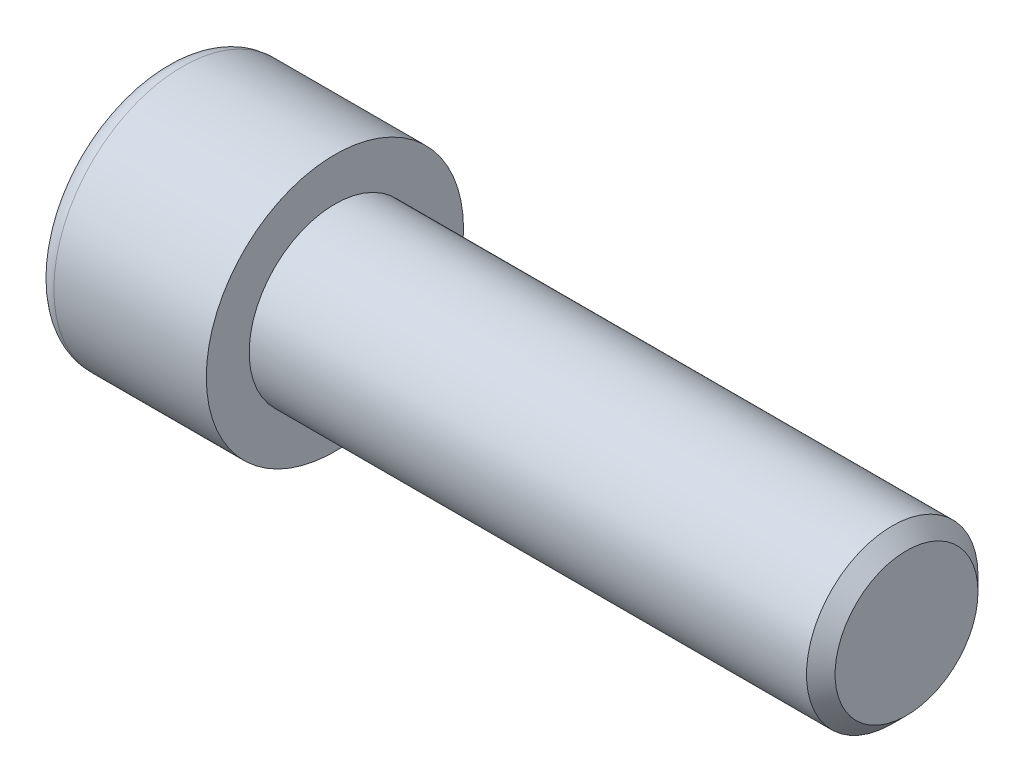
ISO-10303-21;
HEADER;
FILE_DESCRIPTION(('STEP AP214'),'2;1');
FILE_NAME('part.step','',(''),(''),'','','');
FILE_SCHEMA(('AUTOMOTIVE_DESIGN { 1 0 10303 214 1 1 1 1 }'));
ENDSEC;
DATA;
#1=APPLICATION_CONTEXT('core data for automotive mechanical design processes');
#2=APPLICATION_PROTOCOL_DEFINITION('international standard','automotive_design',2000,#1);
#3=PRODUCT_CONTEXT('',#1,'mechanical');
#4=PRODUCT('Part','Part','',(#3));
#5=PRODUCT_RELATED_PRODUCT_CATEGORY('part','',(#4));
#6=PRODUCT_DEFINITION_FORMATION('','',#4);
#7=PRODUCT_DEFINITION_CONTEXT('part definition',#1,'design');
#8=PRODUCT_DEFINITION('design','',#6,#7);
#9=PRODUCT_DEFINITION_SHAPE('','',#8);
#10=(LENGTH_UNIT() NAMED_UNIT(*) SI_UNIT(.MILLI.,.METRE.));
#11=(NAMED_UNIT(*) PLANE_ANGLE_UNIT() SI_UNIT($,.RADIAN.));
#12=(NAMED_UNIT(*) SI_UNIT($,.STERADIAN.) SOLID_ANGLE_UNIT());
#13=UNCERTAINTY_MEASURE_WITH_UNIT(LENGTH_MEASURE(1.E-05),#10,'distance_accuracy_value','');
#14=(GEOMETRIC_REPRESENTATION_CONTEXT(3) GLOBAL_UNCERTAINTY_ASSIGNED_CONTEXT((#13)) GLOBAL_UNIT_ASSIGNED_CONTEXT((#10,
#11,#12)) REPRESENTATION_CONTEXT('',''));
#15=CARTESIAN_POINT('',(0.,0.,0.));
#16=DIRECTION('',(0.,0.,1.));
#17=DIRECTION('',(1.,0.,0.));
#18=AXIS2_PLACEMENT_3D('',#15,#16,#17);
#19=CARTESIAN_POINT('',(20.,0.,0.));
#20=DIRECTION('',(-1.,0.,0.));
#21=DIRECTION('',(0.,0.,1.));
#22=AXIS2_PLACEMENT_3D('',#19,#20,#21);
#23=PLANE('',#22);
#24=CARTESIAN_POINT('',(20.,0.,0.));
#25=DIRECTION('',(-1.,0.,0.));
#26=DIRECTION('',(0.,0.,1.));
#27=AXIS2_PLACEMENT_3D('',#24,#25,#26);
#28=CIRCLE('',#27,13.5);
#29=CARTESIAN_POINT('',(20.,0.,13.5));
#30=VERTEX_POINT('',#29);
#31=CARTESIAN_POINT('',(20.,11.6913429510899,6.75));
#32=VERTEX_POINT('',#31);
#33=EDGE_CURVE('E139',#30,#32,#28,.T.);
#34=ORIENTED_EDGE('',*,*,#33,.F.);
#35=DIRECTION('',(0.,1.,0.));
#36=VECTOR('',#35,1.);
#37=CARTESIAN_POINT('',(20.,-7.79422863405995,13.5));
#38=LINE('',#37,#36);
#39=CARTESIAN_POINT('',(20.,7.79422863405995,13.5));
#40=VERTEX_POINT('',#39);
#41=EDGE_CURVE('E174',#30,#40,#38,.T.);
#42=ORIENTED_EDGE('',*,*,#41,.T.);
#43=DIRECTION('',(0.,0.5,-0.866025403784439));
#44=VECTOR('',#43,1.);
#45=CARTESIAN_POINT('',(20.,7.79422863405995,13.5));
#46=LINE('',#45,#44);
#47=EDGE_CURVE('E149',#40,#32,#46,.T.);
#48=ORIENTED_EDGE('',*,*,#47,.T.);
#49=EDGE_LOOP('',(#34,#42,#48));
#50=FACE_BOUND('',#49,.T.);
#51=ADVANCED_FACE('F53',(#50),#23,.T.);
#52=CARTESIAN_POINT('',(20.,11.6913429510899,-6.75));
#53=VERTEX_POINT('',#52);
#54=EDGE_CURVE('E145',#32,#53,#28,.T.);
#55=ORIENTED_EDGE('',*,*,#54,.F.);
#56=CARTESIAN_POINT('',(20.,15.5884572681199,0.));
#57=VERTEX_POINT('',#56);
#58=EDGE_CURVE('E154',#32,#57,#46,.T.);
#59=ORIENTED_EDGE('',*,*,#58,.T.);
#60=DIRECTION('',(0.,-0.5,-0.866025403784439));
#61=VECTOR('',#60,1.);
#62=CARTESIAN_POINT('',(20.,15.5884572681199,0.));
#63=LINE('',#62,#61);
#64=EDGE_CURVE('E155',#57,#53,#63,.T.);
#65=ORIENTED_EDGE('',*,*,#64,.T.);
#66=EDGE_LOOP('',(#55,#59,#65));
#67=FACE_BOUND('',#66,.T.);
#68=ADVANCED_FACE('F248',(#67),#23,.T.);
#69=CARTESIAN_POINT('',(20.,0.,-13.5));
#70=VERTEX_POINT('',#69);
#71=EDGE_CURVE('E321',#53,#70,#28,.T.);
#72=ORIENTED_EDGE('',*,*,#71,.F.);
#73=CARTESIAN_POINT('',(20.,7.79422863405995,-13.5));
#74=VERTEX_POINT('',#73);
#75=EDGE_CURVE('E153',#53,#74,#63,.T.);
#76=ORIENTED_EDGE('',*,*,#75,.T.);
#77=DIRECTION('',(0.,-1.,0.));
#78=VECTOR('',#77,1.);
#79=CARTESIAN_POINT('',(20.,7.79422863405995,-13.5));
#80=LINE('',#79,#78);
#81=EDGE_CURVE('E160',#74,#70,#80,.T.);
#82=ORIENTED_EDGE('',*,*,#81,.T.);
#83=EDGE_LOOP('',(#72,#76,#82));
#84=FACE_BOUND('',#83,.T.);
#85=ADVANCED_FACE('F255',(#84),#23,.T.);
#86=CARTESIAN_POINT('',(20.,-11.6913429510899,-6.75));
#87=VERTEX_POINT('',#86);
#88=EDGE_CURVE('E286',#70,#87,#28,.T.);
#89=ORIENTED_EDGE('',*,*,#88,.F.);
#90=CARTESIAN_POINT('',(20.,-7.79422863405995,-13.5));
#91=VERTEX_POINT('',#90);
#92=EDGE_CURVE('E159',#70,#91,#80,.T.);
#93=ORIENTED_EDGE('',*,*,#92,.T.);
#94=DIRECTION('',(0.,-0.5,0.866025403784438));
#95=VECTOR('',#94,1.);
#96=CARTESIAN_POINT('',(20.,-7.79422863405995,-13.5));
#97=LINE('',#96,#95);
#98=EDGE_CURVE('E165',#91,#87,#97,.T.);
#99=ORIENTED_EDGE('',*,*,#98,.T.);
#100=EDGE_LOOP('',(#89,#93,#99));
#101=FACE_BOUND('',#100,.T.);
#102=ADVANCED_FACE('F271',(#101),#23,.T.);
#103=CARTESIAN_POINT('',(20.,-11.6913429510899,6.75));
#104=VERTEX_POINT('',#103);
#105=EDGE_CURVE('E70',#87,#104,#28,.T.);
#106=ORIENTED_EDGE('',*,*,#105,.F.);
#107=CARTESIAN_POINT('',(20.,-15.5884572681199,0.));
#108=VERTEX_POINT('',#107);
#109=EDGE_CURVE('E164',#87,#108,#97,.T.);
#110=ORIENTED_EDGE('',*,*,#109,.T.);
#111=DIRECTION('',(0.,0.5,0.866025403784439));
#112=VECTOR('',#111,1.);
#113=CARTESIAN_POINT('',(20.,-15.5884572681199,0.));
#114=LINE('',#113,#112);
#115=EDGE_CURVE('E170',#108,#104,#114,.T.);
#116=ORIENTED_EDGE('',*,*,#115,.T.);
#117=EDGE_LOOP('',(#106,#110,#116));
#118=FACE_BOUND('',#117,.T.);
#119=ADVANCED_FACE('F262',(#118),#23,.T.);
#120=CARTESIAN_POINT('',(0.,0.,0.));
#121=DIRECTION('',(-1.,0.,0.));
#122=DIRECTION('',(0.,0.,1.));
#123=AXIS2_PLACEMENT_3D('',#120,#121,#122);
#124=PLANE('',#123);
#125=CARTESIAN_POINT('',(0.,0.,0.));
#126=DIRECTION('',(-1.,0.,0.));
#127=DIRECTION('',(0.,0.,1.));
#128=AXIS2_PLACEMENT_3D('',#125,#126,#127);
#129=CIRCLE('',#128,23.);
#130=CARTESIAN_POINT('',(0.,0.,23.));
#131=VERTEX_POINT('',#130);
#132=EDGE_CURVE('E228',#131,#131,#129,.T.);
#133=ORIENTED_EDGE('',*,*,#132,.T.);
#134=EDGE_LOOP('',(#133));
#135=FACE_BOUND('',#134,.T.);
#136=DIRECTION('',(0.,0.5,-0.866025403784439));
#137=VECTOR('',#136,1.);
#138=CARTESIAN_POINT('',(0.,7.79422863405995,13.5));
#139=LINE('',#138,#137);
#140=CARTESIAN_POINT('',(0.,7.79422863405995,13.5));
#141=VERTEX_POINT('',#140);
#142=CARTESIAN_POINT('',(0.,15.5884572681199,0.));
#143=VERTEX_POINT('',#142);
#144=EDGE_CURVE('E78',#141,#143,#139,.T.);
#145=ORIENTED_EDGE('',*,*,#144,.F.);
#146=DIRECTION('',(0.,1.,0.));
#147=VECTOR('',#146,1.);
#148=CARTESIAN_POINT('',(0.,-7.79422863405995,13.5));
#149=LINE('',#148,#147);
#150=CARTESIAN_POINT('',(0.,-7.79422863405995,13.5));
#151=VERTEX_POINT('',#150);
#152=EDGE_CURVE('E195',#151,#141,#149,.T.);
#153=ORIENTED_EDGE('',*,*,#152,.F.);
#154=DIRECTION('',(0.,0.5,0.866025403784439));
#155=VECTOR('',#154,1.);
#156=CARTESIAN_POINT('',(0.,-15.5884572681199,0.));
#157=LINE('',#156,#155);
#158=CARTESIAN_POINT('',(0.,-15.5884572681199,0.));
#159=VERTEX_POINT('',#158);
#160=EDGE_CURVE('E191',#159,#151,#157,.T.);
#161=ORIENTED_EDGE('',*,*,#160,.F.);
#162=DIRECTION('',(0.,-0.5,0.866025403784438));
#163=VECTOR('',#162,1.);
#164=CARTESIAN_POINT('',(0.,-7.79422863405995,-13.5));
#165=LINE('',#164,#163);
#166=CARTESIAN_POINT('',(0.,-7.79422863405995,-13.5));
#167=VERTEX_POINT('',#166);
#168=EDGE_CURVE('E187',#167,#159,#165,.T.);
#169=ORIENTED_EDGE('',*,*,#168,.F.);
#170=DIRECTION('',(0.,-1.,0.));
#171=VECTOR('',#170,1.);
#172=CARTESIAN_POINT('',(0.,7.79422863405995,-13.5));
#173=LINE('',#172,#171);
#174=CARTESIAN_POINT('',(0.,7.79422863405995,-13.5));
#175=VERTEX_POINT('',#174);
#176=EDGE_CURVE('E183',#175,#167,#173,.T.);
#177=ORIENTED_EDGE('',*,*,#176,.F.);
#178=DIRECTION('',(0.,-0.5,-0.866025403784439));
#179=VECTOR('',#178,1.);
#180=CARTESIAN_POINT('',(0.,15.5884572681199,0.));
#181=LINE('',#180,#179);
#182=EDGE_CURVE('E143',#143,#175,#181,.T.);
#183=ORIENTED_EDGE('',*,*,#182,.F.);
#184=EDGE_LOOP('',(#145,#153,#161,#169,#177,#183));
#185=FACE_BOUND('',#184,.T.);
#186=ADVANCED_FACE('F270',(#135,#185),#124,.T.);
#187=CARTESIAN_POINT('',(156.,0.,0.));
#188=DIRECTION('',(1.,0.,0.));
#189=DIRECTION('',(0.,0.,-1.));
#190=AXIS2_PLACEMENT_3D('',#187,#188,#189);
#191=CYLINDRICAL_SURFACE('',#190,27.);
#192=CARTESIAN_POINT('',(4.,0.,0.));
#193=DIRECTION('',(-1.,0.,0.));
#194=DIRECTION('',(0.,0.,1.));
#195=AXIS2_PLACEMENT_3D('',#192,#193,#194);
#196=CIRCLE('',#195,27.);
#197=CARTESIAN_POINT('',(4.,0.,27.));
#198=VERTEX_POINT('',#197);
#199=EDGE_CURVE('E224',#198,#198,#196,.F.);
#200=ORIENTED_EDGE('',*,*,#199,.T.);
#201=EDGE_LOOP('',(#200));
#202=FACE_BOUND('',#201,.T.);
#203=CARTESIAN_POINT('',(36.,0.,0.));
#204=DIRECTION('',(1.,0.,0.));
#205=DIRECTION('',(0.,0.,-1.));
#206=AXIS2_PLACEMENT_3D('',#203,#204,#205);
#207=CIRCLE('',#206,27.);
#208=CARTESIAN_POINT('',(36.,0.,-27.));
#209=VERTEX_POINT('',#208);
#210=EDGE_CURVE('E220',#209,#209,#207,.T.);
#211=ORIENTED_EDGE('',*,*,#210,.F.);
#212=EDGE_LOOP('',(#211));
#213=FACE_BOUND('',#212,.T.);
#214=ADVANCED_FACE('F278',(#202,#213),#191,.T.);
#215=CARTESIAN_POINT('',(36.,27.,0.));
#216=DIRECTION('',(1.,0.,0.));
#217=DIRECTION('',(0.,0.,-1.));
#218=AXIS2_PLACEMENT_3D('',#215,#216,#217);
#219=PLANE('',#218);
#220=ORIENTED_EDGE('',*,*,#210,.T.);
#221=EDGE_LOOP('',(#220));
#222=FACE_BOUND('',#221,.T.);
#223=CARTESIAN_POINT('',(36.,0.,0.));
#224=DIRECTION('',(1.,0.,0.));
#225=DIRECTION('',(0.,0.,-1.));
#226=AXIS2_PLACEMENT_3D('',#223,#224,#225);
#227=CIRCLE('',#226,18.);
#228=CARTESIAN_POINT('',(36.,0.,-18.));
#229=VERTEX_POINT('',#228);
#230=EDGE_CURVE('E202',#229,#229,#227,.T.);
#231=ORIENTED_EDGE('',*,*,#230,.F.);
#232=EDGE_LOOP('',(#231));
#233=FACE_BOUND('',#232,.T.);
#234=ADVANCED_FACE('F343',(#222,#233),#219,.T.);
#235=CARTESIAN_POINT('',(156.,0.,0.));
#236=DIRECTION('',(1.,0.,0.));
#237=DIRECTION('',(0.,0.,-1.));
#238=AXIS2_PLACEMENT_3D('',#235,#236,#237);
#239=CYLINDRICAL_SURFACE('',#238,18.);
#240=CARTESIAN_POINT('',(153.,0.,0.));
#241=DIRECTION('',(1.,0.,0.));
#242=DIRECTION('',(0.,0.,-1.));
#243=AXIS2_PLACEMENT_3D('',#240,#241,#242);
#244=CIRCLE('',#243,18.);
#245=CARTESIAN_POINT('',(153.,0.,-18.));
#246=VERTEX_POINT('',#245);
#247=EDGE_CURVE('E11',#246,#246,#244,.F.);
#248=ORIENTED_EDGE('',*,*,#247,.T.);
#249=EDGE_LOOP('',(#248));
#250=FACE_BOUND('',#249,.T.);
#251=ORIENTED_EDGE('',*,*,#230,.T.);
#252=EDGE_LOOP('',(#251));
#253=FACE_BOUND('',#252,.T.);
#254=ADVANCED_FACE('F356',(#250,#253),#239,.T.);
#255=CARTESIAN_POINT('',(156.,18.,0.));
#256=DIRECTION('',(1.,0.,0.));
#257=DIRECTION('',(0.,0.,-1.));
#258=AXIS2_PLACEMENT_3D('',#255,#256,#257);
#259=PLANE('',#258);
#260=CARTESIAN_POINT('',(156.,0.,0.));
#261=DIRECTION('',(1.,0.,0.));
#262=DIRECTION('',(0.,0.,-1.));
#263=AXIS2_PLACEMENT_3D('',#260,#261,#262);
#264=CIRCLE('',#263,15.);
#265=CARTESIAN_POINT('',(156.,0.,-15.));
#266=VERTEX_POINT('',#265);
#267=EDGE_CURVE('E63',#266,#266,#264,.T.);
#268=ORIENTED_EDGE('',*,*,#267,.T.);
#269=EDGE_LOOP('',(#268));
#270=FACE_BOUND('',#269,.T.);
#271=ADVANCED_FACE('F235',(#270),#259,.T.);
#272=CARTESIAN_POINT('',(20.,7.79422863405995,13.5));
#273=DIRECTION('',(0.,0.866025403784439,0.5));
#274=DIRECTION('',(0.,-0.5,0.866025403784439));
#275=AXIS2_PLACEMENT_3D('',#272,#273,#274);
#276=PLANE('',#275);
#277=ORIENTED_EDGE('',*,*,#144,.T.);
#278=DIRECTION('',(-1.,0.,0.));
#279=VECTOR('',#278,1.);
#280=CARTESIAN_POINT('',(20.,15.5884572681199,0.));
#281=LINE('',#280,#279);
#282=EDGE_CURVE('E178',#57,#143,#281,.T.);
#283=ORIENTED_EDGE('',*,*,#282,.F.);
#284=ORIENTED_EDGE('',*,*,#58,.F.);
#285=ORIENTED_EDGE('',*,*,#47,.F.);
#286=DIRECTION('',(-1.,0.,0.));
#287=VECTOR('',#286,1.);
#288=CARTESIAN_POINT('',(20.,7.79422863405995,13.5));
#289=LINE('',#288,#287);
#290=EDGE_CURVE('E199',#40,#141,#289,.T.);
#291=ORIENTED_EDGE('',*,*,#290,.T.);
#292=EDGE_LOOP('',(#277,#283,#284,#285,#291));
#293=FACE_BOUND('',#292,.T.);
#294=ADVANCED_FACE('F315',(#293),#276,.F.);
#295=CARTESIAN_POINT('',(20.,-7.79422863405995,13.5));
#296=DIRECTION('',(0.,0.,1.));
#297=DIRECTION('',(0.,-1.,0.));
#298=AXIS2_PLACEMENT_3D('',#295,#296,#297);
#299=PLANE('',#298);
#300=ORIENTED_EDGE('',*,*,#152,.T.);
#301=ORIENTED_EDGE('',*,*,#290,.F.);
#302=ORIENTED_EDGE('',*,*,#41,.F.);
#303=CARTESIAN_POINT('',(20.,-7.79422863405995,13.5));
#304=VERTEX_POINT('',#303);
#305=EDGE_CURVE('E175',#304,#30,#38,.T.);
#306=ORIENTED_EDGE('',*,*,#305,.F.);
#307=DIRECTION('',(-1.,0.,0.));
#308=VECTOR('',#307,1.);
#309=CARTESIAN_POINT('',(20.,-7.79422863405995,13.5));
#310=LINE('',#309,#308);
#311=EDGE_CURVE('E203',#304,#151,#310,.T.);
#312=ORIENTED_EDGE('',*,*,#311,.T.);
#313=EDGE_LOOP('',(#300,#301,#302,#306,#312));
#314=FACE_BOUND('',#313,.T.);
#315=ADVANCED_FACE('F439',(#314),#299,.F.);
#316=CARTESIAN_POINT('',(20.,-15.5884572681199,0.));
#317=DIRECTION('',(0.,-0.866025403784439,0.5));
#318=DIRECTION('',(0.,-0.5,-0.866025403784439));
#319=AXIS2_PLACEMENT_3D('',#316,#317,#318);
#320=PLANE('',#319);
#321=ORIENTED_EDGE('',*,*,#160,.T.);
#322=ORIENTED_EDGE('',*,*,#311,.F.);
#323=EDGE_CURVE('E169',#104,#304,#114,.T.);
#324=ORIENTED_EDGE('',*,*,#323,.F.);
#325=ORIENTED_EDGE('',*,*,#115,.F.);
#326=DIRECTION('',(-1.,0.,0.));
#327=VECTOR('',#326,1.);
#328=CARTESIAN_POINT('',(20.,-15.5884572681199,0.));
#329=LINE('',#328,#327);
#330=EDGE_CURVE('E206',#108,#159,#329,.T.);
#331=ORIENTED_EDGE('',*,*,#330,.T.);
#332=EDGE_LOOP('',(#321,#322,#324,#325,#331));
#333=FACE_BOUND('',#332,.T.);
#334=ADVANCED_FACE('F304',(#333),#320,.F.);
#335=CARTESIAN_POINT('',(20.,-7.79422863405995,-13.5));
#336=DIRECTION('',(0.,-0.866025403784439,-0.5));
#337=DIRECTION('',(0.,0.5,-0.866025403784439));
#338=AXIS2_PLACEMENT_3D('',#335,#336,#337);
#339=PLANE('',#338);
#340=ORIENTED_EDGE('',*,*,#168,.T.);
#341=ORIENTED_EDGE('',*,*,#330,.F.);
#342=ORIENTED_EDGE('',*,*,#109,.F.);
#343=ORIENTED_EDGE('',*,*,#98,.F.);
#344=DIRECTION('',(-1.,0.,0.));
#345=VECTOR('',#344,1.);
#346=CARTESIAN_POINT('',(20.,-7.79422863405995,-13.5));
#347=LINE('',#346,#345);
#348=EDGE_CURVE('E209',#91,#167,#347,.T.);
#349=ORIENTED_EDGE('',*,*,#348,.T.);
#350=EDGE_LOOP('',(#340,#341,#342,#343,#349));
#351=FACE_BOUND('',#350,.T.);
#352=ADVANCED_FACE('F289',(#351),#339,.F.);
#353=CARTESIAN_POINT('',(20.,7.79422863405995,-13.5));
#354=DIRECTION('',(0.,0.,-1.));
#355=DIRECTION('',(-1.,0.,0.));
#356=AXIS2_PLACEMENT_3D('',#353,#354,#355);
#357=PLANE('',#356);
#358=ORIENTED_EDGE('',*,*,#176,.T.);
#359=ORIENTED_EDGE('',*,*,#348,.F.);
#360=ORIENTED_EDGE('',*,*,#92,.F.);
#361=ORIENTED_EDGE('',*,*,#81,.F.);
#362=DIRECTION('',(-1.,0.,0.));
#363=VECTOR('',#362,1.);
#364=CARTESIAN_POINT('',(20.,7.79422863405995,-13.5));
#365=LINE('',#364,#363);
#366=EDGE_CURVE('E212',#74,#175,#365,.T.);
#367=ORIENTED_EDGE('',*,*,#366,.T.);
#368=EDGE_LOOP('',(#358,#359,#360,#361,#367));
#369=FACE_BOUND('',#368,.T.);
#370=ADVANCED_FACE('F266',(#369),#357,.F.);
#371=CARTESIAN_POINT('',(20.,15.5884572681199,0.));
#372=DIRECTION('',(0.,0.866025403784439,-0.5));
#373=DIRECTION('',(0.,0.5,0.866025403784439));
#374=AXIS2_PLACEMENT_3D('',#371,#372,#373);
#375=PLANE('',#374);
#376=ORIENTED_EDGE('',*,*,#182,.T.);
#377=ORIENTED_EDGE('',*,*,#366,.F.);
#378=ORIENTED_EDGE('',*,*,#75,.F.);
#379=ORIENTED_EDGE('',*,*,#64,.F.);
#380=ORIENTED_EDGE('',*,*,#282,.T.);
#381=EDGE_LOOP('',(#376,#377,#378,#379,#380));
#382=FACE_BOUND('',#381,.T.);
#383=ADVANCED_FACE('F260',(#382),#375,.F.);
#384=EDGE_CURVE('E147',#104,#30,#28,.T.);
#385=ORIENTED_EDGE('',*,*,#384,.F.);
#386=ORIENTED_EDGE('',*,*,#323,.T.);
#387=ORIENTED_EDGE('',*,*,#305,.T.);
#388=EDGE_LOOP('',(#385,#386,#387));
#389=FACE_BOUND('',#388,.T.);
#390=ADVANCED_FACE('F132',(#389),#23,.T.);
#391=CARTESIAN_POINT('',(25.,0.,0.));
#392=DIRECTION('',(-1.,0.,0.));
#393=DIRECTION('',(0.,0.,1.));
#394=AXIS2_PLACEMENT_3D('',#391,#392,#393);
#395=CONICAL_SURFACE('',#394,13.5,1.02974425867665);
#396=CARTESIAN_POINT('',(33.1116183568721,0.,0.));
#397=VERTEX_POINT('',#396);
#398=VERTEX_LOOP('',#397);
#399=FACE_BOUND('',#398,.T.);
#400=CARTESIAN_POINT('',(25.,0.,0.));
#401=DIRECTION('',(-1.,0.,0.));
#402=DIRECTION('',(0.,0.,1.));
#403=AXIS2_PLACEMENT_3D('',#400,#401,#402);
#404=CIRCLE('',#403,13.5);
#405=CARTESIAN_POINT('',(25.,0.,13.5));
#406=VERTEX_POINT('',#405);
#407=EDGE_CURVE('E136',#406,#406,#404,.T.);
#408=ORIENTED_EDGE('',*,*,#407,.T.);
#409=EDGE_LOOP('',(#408));
#410=FACE_BOUND('',#409,.T.);
#411=ADVANCED_FACE('F128',(#399,#410),#395,.F.);
#412=CARTESIAN_POINT('',(20.,0.,0.));
#413=DIRECTION('',(-1.,0.,0.));
#414=DIRECTION('',(0.,0.,1.));
#415=AXIS2_PLACEMENT_3D('',#412,#413,#414);
#416=CYLINDRICAL_SURFACE('',#415,13.5);
#417=ORIENTED_EDGE('',*,*,#407,.F.);
#418=EDGE_LOOP('',(#417));
#419=FACE_BOUND('',#418,.T.);
#420=ORIENTED_EDGE('',*,*,#33,.T.);
#421=ORIENTED_EDGE('',*,*,#54,.T.);
#422=ORIENTED_EDGE('',*,*,#71,.T.);
#423=ORIENTED_EDGE('',*,*,#88,.T.);
#424=ORIENTED_EDGE('',*,*,#105,.T.);
#425=ORIENTED_EDGE('',*,*,#384,.T.);
#426=EDGE_LOOP('',(#420,#421,#422,#423,#424,#425));
#427=FACE_BOUND('',#426,.T.);
#428=ADVANCED_FACE('F131',(#419,#427),#416,.F.);
#429=CARTESIAN_POINT('',(4.,0.,0.));
#430=DIRECTION('',(-1.,0.,0.));
#431=DIRECTION('',(0.,0.,1.));
#432=AXIS2_PLACEMENT_3D('',#429,#430,#431);
#433=TOROIDAL_SURFACE('',#432,23.,4.);
#434=ORIENTED_EDGE('',*,*,#132,.F.);
#435=EDGE_LOOP('',(#434));
#436=FACE_BOUND('',#435,.T.);
#437=ORIENTED_EDGE('',*,*,#199,.F.);
#438=EDGE_LOOP('',(#437));
#439=FACE_BOUND('',#438,.T.);
#440=ADVANCED_FACE('F238',(#436,#439),#433,.T.);
#441=CARTESIAN_POINT('',(156.,0.,0.));
#442=DIRECTION('',(-1.,0.,0.));
#443=DIRECTION('',(0.,0.,1.));
#444=AXIS2_PLACEMENT_3D('',#441,#442,#443);
#445=CONICAL_SURFACE('',#444,15.,0.78539816339745);
#446=ORIENTED_EDGE('',*,*,#247,.F.);
#447=EDGE_LOOP('',(#446));
#448=FACE_BOUND('',#447,.T.);
#449=ORIENTED_EDGE('',*,*,#267,.F.);
#450=EDGE_LOOP('',(#449));
#451=FACE_BOUND('',#450,.T.);
#452=ADVANCED_FACE('F56',(#448,#451),#445,.T.);
#453=CLOSED_SHELL('',(#51,#68,#85,#102,#119,#186,#214,#234,#254,#271,#294,#315,#334,#352,#370,
#383,#390,#411,#428,#440,#452));
#454=MANIFOLD_SOLID_BREP('B2',#453);
#455=ADVANCED_BREP_SHAPE_REPRESENTATION('',(#18,#454),#14);
#456=SHAPE_DEFINITION_REPRESENTATION(#9,#455);
ENDSEC;
END-ISO-10303-21;
